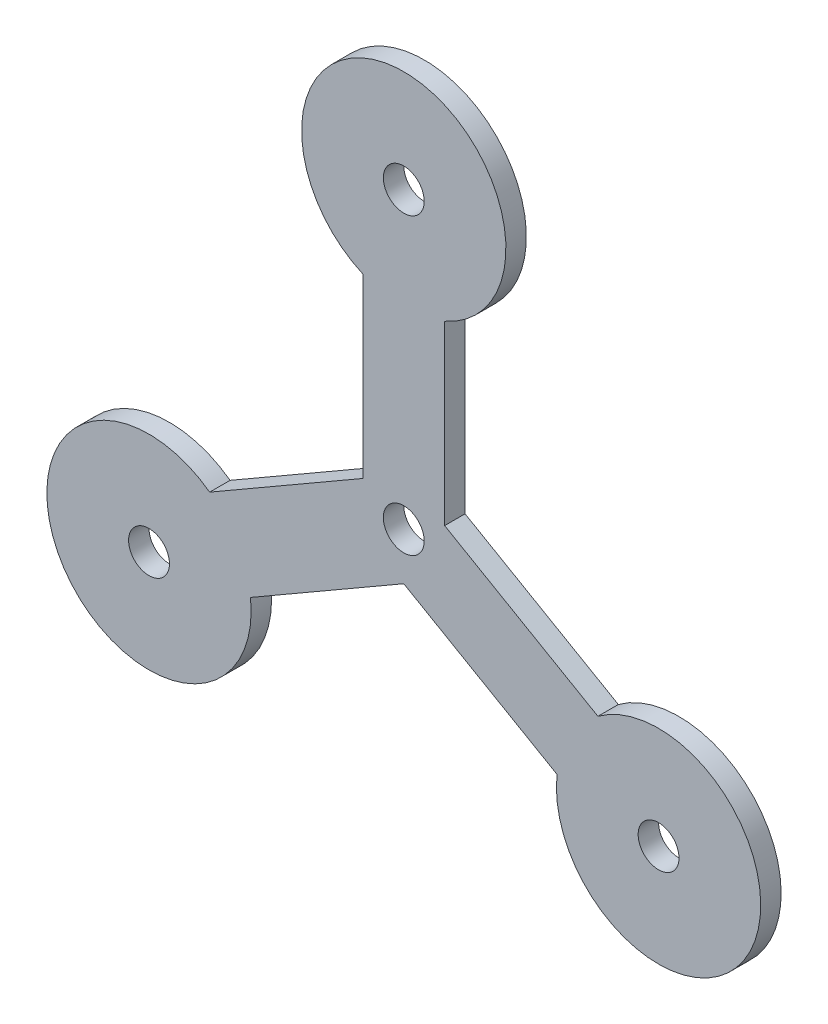
ISO-10303-21;
HEADER;
FILE_DESCRIPTION(('STEP AP214'),'2;1');
FILE_NAME('part.step','',(''),(''),'','','');
FILE_SCHEMA(('AUTOMOTIVE_DESIGN { 1 0 10303 214 1 1 1 1 }'));
ENDSEC;
DATA;
#1=APPLICATION_CONTEXT('core data for automotive mechanical design processes');
#2=APPLICATION_PROTOCOL_DEFINITION('international standard','automotive_design',2000,#1);
#3=PRODUCT_CONTEXT('',#1,'mechanical');
#4=PRODUCT('Part','Part','',(#3));
#5=PRODUCT_RELATED_PRODUCT_CATEGORY('part','',(#4));
#6=PRODUCT_DEFINITION_FORMATION('','',#4);
#7=PRODUCT_DEFINITION_CONTEXT('part definition',#1,'design');
#8=PRODUCT_DEFINITION('design','',#6,#7);
#9=PRODUCT_DEFINITION_SHAPE('','',#8);
#10=(LENGTH_UNIT() NAMED_UNIT(*) SI_UNIT(.MILLI.,.METRE.));
#11=(NAMED_UNIT(*) PLANE_ANGLE_UNIT() SI_UNIT($,.RADIAN.));
#12=(NAMED_UNIT(*) SI_UNIT($,.STERADIAN.) SOLID_ANGLE_UNIT());
#13=UNCERTAINTY_MEASURE_WITH_UNIT(LENGTH_MEASURE(1.E-05),#10,'distance_accuracy_value','');
#14=(GEOMETRIC_REPRESENTATION_CONTEXT(3) GLOBAL_UNCERTAINTY_ASSIGNED_CONTEXT((#13)) GLOBAL_UNIT_ASSIGNED_CONTEXT((#10,
#11,#12)) REPRESENTATION_CONTEXT('',''));
#15=CARTESIAN_POINT('',(0.,0.,0.));
#16=DIRECTION('',(0.,0.,1.));
#17=DIRECTION('',(1.,0.,0.));
#18=AXIS2_PLACEMENT_3D('',#15,#16,#17);
#19=CARTESIAN_POINT('',(-20.,11.5470053837933,10.));
#20=DIRECTION('',(1.,0.,0.));
#21=DIRECTION('',(0.,0.,-1.));
#22=AXIS2_PLACEMENT_3D('',#19,#20,#21);
#23=PLANE('',#22);
#24=DIRECTION('',(0.,-1.,0.));
#25=VECTOR('',#24,1.);
#26=CARTESIAN_POINT('',(-20.,11.5470053837933,10.));
#27=LINE('',#26,#25);
#28=CARTESIAN_POINT('',(-20.,98.1742430504419,10.));
#29=VERTEX_POINT('',#28);
#30=CARTESIAN_POINT('',(-20.,11.5470053837933,10.));
#31=VERTEX_POINT('',#30);
#32=EDGE_CURVE('E126',#29,#31,#27,.T.);
#33=ORIENTED_EDGE('',*,*,#32,.F.);
#34=DIRECTION('',(0.,0.,1.));
#35=VECTOR('',#34,1.);
#36=CARTESIAN_POINT('',(-20.,98.1742430504419,0.));
#37=LINE('',#36,#35);
#38=CARTESIAN_POINT('',(-20.,98.1742430504419,0.));
#39=VERTEX_POINT('',#38);
#40=EDGE_CURVE('E168',#29,#39,#37,.F.);
#41=ORIENTED_EDGE('',*,*,#40,.T.);
#42=DIRECTION('',(0.,-1.,0.));
#43=VECTOR('',#42,1.);
#44=CARTESIAN_POINT('',(-20.,11.5470053837933,0.));
#45=LINE('',#44,#43);
#46=CARTESIAN_POINT('',(-20.,11.5470053837933,0.));
#47=VERTEX_POINT('',#46);
#48=EDGE_CURVE('E149',#39,#47,#45,.T.);
#49=ORIENTED_EDGE('',*,*,#48,.T.);
#50=DIRECTION('',(0.,0.,-1.));
#51=VECTOR('',#50,1.);
#52=CARTESIAN_POINT('',(-20.,11.5470053837933,10.));
#53=LINE('',#52,#51);
#54=EDGE_CURVE('E11',#31,#47,#53,.T.);
#55=ORIENTED_EDGE('',*,*,#54,.F.);
#56=EDGE_LOOP('',(#33,#41,#49,#55));
#57=FACE_BOUND('',#56,.T.);
#58=ADVANCED_FACE('F32',(#57),#23,.F.);
#59=CARTESIAN_POINT('',(-134.707658144959,-54.6794919243113,10.));
#60=DIRECTION('',(0.500000000000004,-0.866025403784436,0.));
#61=DIRECTION('',(0.866025403784436,0.500000000000004,0.));
#62=AXIS2_PLACEMENT_3D('',#59,#60,#61);
#63=PLANE('',#62);
#64=DIRECTION('',(-0.866025403784436,-0.500000000000004,0.));
#65=VECTOR('',#64,1.);
#66=CARTESIAN_POINT('',(-134.707658144959,-54.6794919243113,0.));
#67=LINE('',#66,#65);
#68=CARTESIAN_POINT('',(-95.0213884789905,-31.7666134495318,0.));
#69=VERTEX_POINT('',#68);
#70=EDGE_CURVE('E148',#47,#69,#67,.T.);
#71=ORIENTED_EDGE('',*,*,#70,.T.);
#72=DIRECTION('',(0.,0.,1.));
#73=VECTOR('',#72,1.);
#74=CARTESIAN_POINT('',(-95.0213884789905,-31.7666134495319,0.));
#75=LINE('',#74,#73);
#76=CARTESIAN_POINT('',(-95.0213884789905,-31.7666134495318,10.));
#77=VERTEX_POINT('',#76);
#78=EDGE_CURVE('E153',#69,#77,#75,.T.);
#79=ORIENTED_EDGE('',*,*,#78,.T.);
#80=DIRECTION('',(-0.866025403784436,-0.500000000000004,0.));
#81=VECTOR('',#80,1.);
#82=CARTESIAN_POINT('',(-134.707658144959,-54.6794919243113,10.));
#83=LINE('',#82,#81);
#84=EDGE_CURVE('E160',#31,#77,#83,.T.);
#85=ORIENTED_EDGE('',*,*,#84,.F.);
#86=ORIENTED_EDGE('',*,*,#54,.T.);
#87=EDGE_LOOP('',(#71,#79,#85,#86));
#88=FACE_BOUND('',#87,.T.);
#89=ADVANCED_FACE('F231',(#88),#63,.F.);
#90=CARTESIAN_POINT('',(0.,-23.0940107675842,10.));
#91=DIRECTION('',(-0.500000000000005,0.866025403784436,0.));
#92=DIRECTION('',(-0.866025403784436,-0.500000000000005,0.));
#93=AXIS2_PLACEMENT_3D('',#90,#91,#92);
#94=PLANE('',#93);
#95=DIRECTION('',(0.866025403784436,0.500000000000004,0.));
#96=VECTOR('',#95,1.);
#97=CARTESIAN_POINT('',(0.,-23.0940107675842,10.));
#98=LINE('',#97,#96);
#99=CARTESIAN_POINT('',(-75.0213884789903,-66.4076296009093,10.));
#100=VERTEX_POINT('',#99);
#101=CARTESIAN_POINT('',(0.,-23.0940107675842,10.));
#102=VERTEX_POINT('',#101);
#103=EDGE_CURVE('E158',#100,#102,#98,.T.);
#104=ORIENTED_EDGE('',*,*,#103,.F.);
#105=DIRECTION('',(0.,0.,1.));
#106=VECTOR('',#105,1.);
#107=CARTESIAN_POINT('',(-75.0213884789903,-66.4076296009093,0.));
#108=LINE('',#107,#106);
#109=CARTESIAN_POINT('',(-75.0213884789903,-66.4076296009093,0.));
#110=VERTEX_POINT('',#109);
#111=EDGE_CURVE('E165',#100,#110,#108,.F.);
#112=ORIENTED_EDGE('',*,*,#111,.T.);
#113=DIRECTION('',(0.866025403784436,0.500000000000004,0.));
#114=VECTOR('',#113,1.);
#115=CARTESIAN_POINT('',(0.,-23.0940107675842,0.));
#116=LINE('',#115,#114);
#117=CARTESIAN_POINT('',(0.,-23.0940107675842,0.));
#118=VERTEX_POINT('',#117);
#119=EDGE_CURVE('E128',#110,#118,#116,.T.);
#120=ORIENTED_EDGE('',*,*,#119,.T.);
#121=DIRECTION('',(0.,0.,-1.));
#122=VECTOR('',#121,1.);
#123=CARTESIAN_POINT('',(0.,-23.0940107675842,10.));
#124=LINE('',#123,#122);
#125=EDGE_CURVE('E39',#102,#118,#124,.T.);
#126=ORIENTED_EDGE('',*,*,#125,.F.);
#127=EDGE_LOOP('',(#104,#112,#120,#126));
#128=FACE_BOUND('',#127,.T.);
#129=ADVANCED_FACE('F226',(#128),#94,.F.);
#130=CARTESIAN_POINT('',(114.707658144959,-89.3205080756888,10.));
#131=DIRECTION('',(0.500000000000004,0.866025403784436,0.));
#132=DIRECTION('',(-0.866025403784436,0.500000000000004,0.));
#133=AXIS2_PLACEMENT_3D('',#130,#131,#132);
#134=PLANE('',#133);
#135=DIRECTION('',(0.866025403784436,-0.500000000000004,0.));
#136=VECTOR('',#135,1.);
#137=CARTESIAN_POINT('',(114.707658144959,-89.3205080756888,0.));
#138=LINE('',#137,#136);
#139=CARTESIAN_POINT('',(75.0213884789898,-66.407629600909,0.));
#140=VERTEX_POINT('',#139);
#141=EDGE_CURVE('E124',#118,#140,#138,.T.);
#142=ORIENTED_EDGE('',*,*,#141,.T.);
#143=DIRECTION('',(0.,0.,1.));
#144=VECTOR('',#143,1.);
#145=CARTESIAN_POINT('',(75.0213884789898,-66.407629600909,0.));
#146=LINE('',#145,#144);
#147=CARTESIAN_POINT('',(75.0213884789898,-66.407629600909,10.));
#148=VERTEX_POINT('',#147);
#149=EDGE_CURVE('E106',#140,#148,#146,.T.);
#150=ORIENTED_EDGE('',*,*,#149,.T.);
#151=DIRECTION('',(0.866025403784436,-0.500000000000004,0.));
#152=VECTOR('',#151,1.);
#153=CARTESIAN_POINT('',(114.707658144959,-89.3205080756888,10.));
#154=LINE('',#153,#152);
#155=EDGE_CURVE('E139',#102,#148,#154,.T.);
#156=ORIENTED_EDGE('',*,*,#155,.F.);
#157=ORIENTED_EDGE('',*,*,#125,.T.);
#158=EDGE_LOOP('',(#142,#150,#156,#157));
#159=FACE_BOUND('',#158,.T.);
#160=ADVANCED_FACE('F138',(#159),#134,.F.);
#161=CARTESIAN_POINT('',(20.,11.5470053837933,10.));
#162=DIRECTION('',(-0.500000000000004,-0.866025403784436,0.));
#163=DIRECTION('',(0.866025403784436,-0.500000000000004,0.));
#164=AXIS2_PLACEMENT_3D('',#161,#162,#163);
#165=PLANE('',#164);
#166=DIRECTION('',(-0.866025403784436,0.500000000000004,0.));
#167=VECTOR('',#166,1.);
#168=CARTESIAN_POINT('',(20.,11.5470053837933,10.));
#169=LINE('',#168,#167);
#170=CARTESIAN_POINT('',(95.021388478991,-31.7666134495322,10.));
#171=VERTEX_POINT('',#170);
#172=CARTESIAN_POINT('',(20.,11.5470053837933,10.));
#173=VERTEX_POINT('',#172);
#174=EDGE_CURVE('E117',#171,#173,#169,.T.);
#175=ORIENTED_EDGE('',*,*,#174,.F.);
#176=DIRECTION('',(0.,0.,1.));
#177=VECTOR('',#176,1.);
#178=CARTESIAN_POINT('',(95.021388478991,-31.7666134495322,0.));
#179=LINE('',#178,#177);
#180=CARTESIAN_POINT('',(95.021388478991,-31.7666134495322,0.));
#181=VERTEX_POINT('',#180);
#182=EDGE_CURVE('E103',#171,#181,#179,.F.);
#183=ORIENTED_EDGE('',*,*,#182,.T.);
#184=DIRECTION('',(-0.866025403784436,0.500000000000004,0.));
#185=VECTOR('',#184,1.);
#186=CARTESIAN_POINT('',(20.,11.5470053837933,0.));
#187=LINE('',#186,#185);
#188=CARTESIAN_POINT('',(20.,11.5470053837933,0.));
#189=VERTEX_POINT('',#188);
#190=EDGE_CURVE('E115',#181,#189,#187,.T.);
#191=ORIENTED_EDGE('',*,*,#190,.T.);
#192=DIRECTION('',(0.,0.,-1.));
#193=VECTOR('',#192,1.);
#194=CARTESIAN_POINT('',(20.,11.5470053837933,10.));
#195=LINE('',#194,#193);
#196=EDGE_CURVE('E132',#173,#189,#195,.T.);
#197=ORIENTED_EDGE('',*,*,#196,.F.);
#198=EDGE_LOOP('',(#175,#183,#191,#197));
#199=FACE_BOUND('',#198,.T.);
#200=ADVANCED_FACE('F113',(#199),#165,.F.);
#201=CARTESIAN_POINT('',(20.,144.,10.));
#202=DIRECTION('',(-1.,0.,0.));
#203=DIRECTION('',(0.,0.,1.));
#204=AXIS2_PLACEMENT_3D('',#201,#202,#203);
#205=PLANE('',#204);
#206=DIRECTION('',(0.,1.,0.));
#207=VECTOR('',#206,1.);
#208=CARTESIAN_POINT('',(20.,144.,0.));
#209=LINE('',#208,#207);
#210=CARTESIAN_POINT('',(20.,98.1742430504413,0.));
#211=VERTEX_POINT('',#210);
#212=EDGE_CURVE('E123',#189,#211,#209,.T.);
#213=ORIENTED_EDGE('',*,*,#212,.T.);
#214=DIRECTION('',(0.,0.,1.));
#215=VECTOR('',#214,1.);
#216=CARTESIAN_POINT('',(20.,98.1742430504413,0.));
#217=LINE('',#216,#215);
#218=CARTESIAN_POINT('',(20.,98.1742430504413,10.));
#219=VERTEX_POINT('',#218);
#220=EDGE_CURVE('E172',#211,#219,#217,.T.);
#221=ORIENTED_EDGE('',*,*,#220,.T.);
#222=DIRECTION('',(0.,1.,0.));
#223=VECTOR('',#222,1.);
#224=CARTESIAN_POINT('',(20.,144.,10.));
#225=LINE('',#224,#223);
#226=EDGE_CURVE('E133',#173,#219,#225,.T.);
#227=ORIENTED_EDGE('',*,*,#226,.F.);
#228=ORIENTED_EDGE('',*,*,#196,.T.);
#229=EDGE_LOOP('',(#213,#221,#227,#228));
#230=FACE_BOUND('',#229,.T.);
#231=ADVANCED_FACE('F219',(#230),#205,.F.);
#232=CARTESIAN_POINT('',(0.,0.,10.));
#233=DIRECTION('',(0.,0.,1.));
#234=DIRECTION('',(1.,0.,0.));
#235=AXIS2_PLACEMENT_3D('',#232,#233,#234);
#236=PLANE('',#235);
#237=CARTESIAN_POINT('',(0.,0.,10.));
#238=DIRECTION('',(0.,0.,1.));
#239=DIRECTION('',(1.,0.,0.));
#240=AXIS2_PLACEMENT_3D('',#237,#238,#239);
#241=CIRCLE('',#240,10.);
#242=CARTESIAN_POINT('',(10.,0.,10.));
#243=VERTEX_POINT('',#242);
#244=EDGE_CURVE('E201',#243,#243,#241,.T.);
#245=ORIENTED_EDGE('',*,*,#244,.F.);
#246=EDGE_LOOP('',(#245));
#247=FACE_BOUND('',#246,.T.);
#248=CARTESIAN_POINT('',(-124.70765814495,-71.9999999999941,10.));
#249=DIRECTION('',(0.,0.,1.));
#250=DIRECTION('',(1.,0.,0.));
#251=AXIS2_PLACEMENT_3D('',#248,#249,#250);
#252=CIRCLE('',#251,10.0000000000037);
#253=CARTESIAN_POINT('',(-114.707658144947,-71.9999999999941,10.));
#254=VERTEX_POINT('',#253);
#255=EDGE_CURVE('E185',#254,#254,#252,.T.);
#256=ORIENTED_EDGE('',*,*,#255,.F.);
#257=EDGE_LOOP('',(#256));
#258=FACE_BOUND('',#257,.T.);
#259=CARTESIAN_POINT('',(124.707658144949,-71.9999999999965,10.));
#260=DIRECTION('',(0.,0.,1.));
#261=DIRECTION('',(1.,0.,0.));
#262=AXIS2_PLACEMENT_3D('',#259,#260,#261);
#263=CIRCLE('',#262,10.0000000000037);
#264=CARTESIAN_POINT('',(134.707658144953,-71.9999999999965,10.));
#265=VERTEX_POINT('',#264);
#266=EDGE_CURVE('E181',#265,#265,#263,.T.);
#267=ORIENTED_EDGE('',*,*,#266,.F.);
#268=EDGE_LOOP('',(#267));
#269=FACE_BOUND('',#268,.T.);
#270=CARTESIAN_POINT('',(1.40859546249317E-12,143.999999999989,10.));
#271=DIRECTION('',(0.,0.,1.));
#272=DIRECTION('',(1.,0.,0.));
#273=AXIS2_PLACEMENT_3D('',#270,#271,#272);
#274=CIRCLE('',#273,10.0000000000037);
#275=CARTESIAN_POINT('',(10.0000000000051,143.999999999989,10.));
#276=VERTEX_POINT('',#275);
#277=EDGE_CURVE('E188',#276,#276,#274,.T.);
#278=ORIENTED_EDGE('',*,*,#277,.F.);
#279=EDGE_LOOP('',(#278));
#280=FACE_BOUND('',#279,.T.);
#281=ORIENTED_EDGE('',*,*,#155,.T.);
#282=CARTESIAN_POINT('',(124.707658144958,-72.0000000000012,10.));
#283=DIRECTION('',(0.,0.,1.));
#284=DIRECTION('',(1.,0.,0.));
#285=AXIS2_PLACEMENT_3D('',#282,#283,#284);
#286=CIRCLE('',#285,50.);
#287=EDGE_CURVE('E46',#148,#171,#286,.T.);
#288=ORIENTED_EDGE('',*,*,#287,.T.);
#289=ORIENTED_EDGE('',*,*,#174,.T.);
#290=ORIENTED_EDGE('',*,*,#226,.T.);
#291=CARTESIAN_POINT('',(7.07767178198537E-13,144.,10.));
#292=DIRECTION('',(0.,0.,1.));
#293=DIRECTION('',(1.,0.,0.));
#294=AXIS2_PLACEMENT_3D('',#291,#292,#293);
#295=CIRCLE('',#294,50.);
#296=EDGE_CURVE('E176',#219,#29,#295,.T.);
#297=ORIENTED_EDGE('',*,*,#296,.T.);
#298=ORIENTED_EDGE('',*,*,#32,.T.);
#299=ORIENTED_EDGE('',*,*,#84,.T.);
#300=CARTESIAN_POINT('',(-124.707658144959,-72.,10.));
#301=DIRECTION('',(0.,0.,1.));
#302=DIRECTION('',(1.,0.,0.));
#303=AXIS2_PLACEMENT_3D('',#300,#301,#302);
#304=CIRCLE('',#303,50.);
#305=EDGE_CURVE('E53',#77,#100,#304,.T.);
#306=ORIENTED_EDGE('',*,*,#305,.T.);
#307=ORIENTED_EDGE('',*,*,#103,.T.);
#308=EDGE_LOOP('',(#281,#288,#289,#290,#297,#298,#299,#306,#307));
#309=FACE_BOUND('',#308,.T.);
#310=ADVANCED_FACE('F216',(#247,#258,#269,#280,#309),#236,.T.);
#311=CARTESIAN_POINT('',(0.,0.,0.));
#312=DIRECTION('',(0.,0.,1.));
#313=DIRECTION('',(1.,0.,0.));
#314=AXIS2_PLACEMENT_3D('',#311,#312,#313);
#315=PLANE('',#314);
#316=CARTESIAN_POINT('',(0.,0.,0.));
#317=DIRECTION('',(0.,0.,1.));
#318=DIRECTION('',(1.,0.,0.));
#319=AXIS2_PLACEMENT_3D('',#316,#317,#318);
#320=CIRCLE('',#319,10.);
#321=CARTESIAN_POINT('',(10.,0.,0.));
#322=VERTEX_POINT('',#321);
#323=EDGE_CURVE('E196',#322,#322,#320,.T.);
#324=ORIENTED_EDGE('',*,*,#323,.T.);
#325=EDGE_LOOP('',(#324));
#326=FACE_BOUND('',#325,.T.);
#327=CARTESIAN_POINT('',(-124.70765814495,-71.9999999999941,0.));
#328=DIRECTION('',(0.,0.,1.));
#329=DIRECTION('',(1.,0.,0.));
#330=AXIS2_PLACEMENT_3D('',#327,#328,#329);
#331=CIRCLE('',#330,10.0000000000037);
#332=CARTESIAN_POINT('',(-114.707658144947,-71.9999999999941,0.));
#333=VERTEX_POINT('',#332);
#334=EDGE_CURVE('E191',#333,#333,#331,.T.);
#335=ORIENTED_EDGE('',*,*,#334,.T.);
#336=EDGE_LOOP('',(#335));
#337=FACE_BOUND('',#336,.T.);
#338=CARTESIAN_POINT('',(1.40859546249317E-12,143.999999999989,0.));
#339=DIRECTION('',(0.,0.,1.));
#340=DIRECTION('',(1.,0.,0.));
#341=AXIS2_PLACEMENT_3D('',#338,#339,#340);
#342=CIRCLE('',#341,10.0000000000037);
#343=CARTESIAN_POINT('',(10.0000000000051,143.999999999989,0.));
#344=VERTEX_POINT('',#343);
#345=EDGE_CURVE('E195',#344,#344,#342,.T.);
#346=ORIENTED_EDGE('',*,*,#345,.T.);
#347=EDGE_LOOP('',(#346));
#348=FACE_BOUND('',#347,.T.);
#349=CARTESIAN_POINT('',(124.707658144949,-71.9999999999965,0.));
#350=DIRECTION('',(0.,0.,1.));
#351=DIRECTION('',(1.,0.,0.));
#352=AXIS2_PLACEMENT_3D('',#349,#350,#351);
#353=CIRCLE('',#352,10.0000000000037);
#354=CARTESIAN_POINT('',(134.707658144953,-71.9999999999965,0.));
#355=VERTEX_POINT('',#354);
#356=EDGE_CURVE('E192',#355,#355,#353,.T.);
#357=ORIENTED_EDGE('',*,*,#356,.T.);
#358=EDGE_LOOP('',(#357));
#359=FACE_BOUND('',#358,.T.);
#360=ORIENTED_EDGE('',*,*,#190,.F.);
#361=CARTESIAN_POINT('',(124.707658144958,-72.0000000000012,0.));
#362=DIRECTION('',(0.,0.,1.));
#363=DIRECTION('',(1.,0.,0.));
#364=AXIS2_PLACEMENT_3D('',#361,#362,#363);
#365=CIRCLE('',#364,50.);
#366=EDGE_CURVE('E100',#140,#181,#365,.T.);
#367=ORIENTED_EDGE('',*,*,#366,.F.);
#368=ORIENTED_EDGE('',*,*,#141,.F.);
#369=ORIENTED_EDGE('',*,*,#119,.F.);
#370=CARTESIAN_POINT('',(-124.707658144959,-72.,0.));
#371=DIRECTION('',(0.,0.,1.));
#372=DIRECTION('',(1.,0.,0.));
#373=AXIS2_PLACEMENT_3D('',#370,#371,#372);
#374=CIRCLE('',#373,50.);
#375=EDGE_CURVE('E145',#69,#110,#374,.T.);
#376=ORIENTED_EDGE('',*,*,#375,.F.);
#377=ORIENTED_EDGE('',*,*,#70,.F.);
#378=ORIENTED_EDGE('',*,*,#48,.F.);
#379=CARTESIAN_POINT('',(7.07767178198537E-13,144.,0.));
#380=DIRECTION('',(0.,0.,1.));
#381=DIRECTION('',(1.,0.,0.));
#382=AXIS2_PLACEMENT_3D('',#379,#380,#381);
#383=CIRCLE('',#382,50.);
#384=EDGE_CURVE('E175',#211,#39,#383,.T.);
#385=ORIENTED_EDGE('',*,*,#384,.F.);
#386=ORIENTED_EDGE('',*,*,#212,.F.);
#387=EDGE_LOOP('',(#360,#367,#368,#369,#376,#377,#378,#385,#386));
#388=FACE_BOUND('',#387,.T.);
#389=ADVANCED_FACE('F120',(#326,#337,#348,#359,#388),#315,.F.);
#390=CARTESIAN_POINT('',(-124.707658144959,-72.,0.));
#391=DIRECTION('',(0.,0.,1.));
#392=DIRECTION('',(1.,0.,0.));
#393=AXIS2_PLACEMENT_3D('',#390,#391,#392);
#394=CYLINDRICAL_SURFACE('',#393,50.);
#395=ORIENTED_EDGE('',*,*,#78,.F.);
#396=ORIENTED_EDGE('',*,*,#375,.T.);
#397=ORIENTED_EDGE('',*,*,#111,.F.);
#398=ORIENTED_EDGE('',*,*,#305,.F.);
#399=EDGE_LOOP('',(#395,#396,#397,#398));
#400=FACE_BOUND('',#399,.T.);
#401=ADVANCED_FACE('F228',(#400),#394,.T.);
#402=CARTESIAN_POINT('',(7.07767178198537E-13,144.,0.));
#403=DIRECTION('',(0.,0.,1.));
#404=DIRECTION('',(1.,0.,0.));
#405=AXIS2_PLACEMENT_3D('',#402,#403,#404);
#406=CYLINDRICAL_SURFACE('',#405,50.);
#407=ORIENTED_EDGE('',*,*,#40,.F.);
#408=ORIENTED_EDGE('',*,*,#296,.F.);
#409=ORIENTED_EDGE('',*,*,#220,.F.);
#410=ORIENTED_EDGE('',*,*,#384,.T.);
#411=EDGE_LOOP('',(#407,#408,#409,#410));
#412=FACE_BOUND('',#411,.T.);
#413=ADVANCED_FACE('F239',(#412),#406,.T.);
#414=CARTESIAN_POINT('',(124.707658144958,-72.0000000000012,0.));
#415=DIRECTION('',(0.,0.,1.));
#416=DIRECTION('',(1.,0.,0.));
#417=AXIS2_PLACEMENT_3D('',#414,#415,#416);
#418=CYLINDRICAL_SURFACE('',#417,50.);
#419=ORIENTED_EDGE('',*,*,#149,.F.);
#420=ORIENTED_EDGE('',*,*,#366,.T.);
#421=ORIENTED_EDGE('',*,*,#182,.F.);
#422=ORIENTED_EDGE('',*,*,#287,.F.);
#423=EDGE_LOOP('',(#419,#420,#421,#422));
#424=FACE_BOUND('',#423,.T.);
#425=ADVANCED_FACE('F102',(#424),#418,.T.);
#426=CARTESIAN_POINT('',(124.707658144949,-71.9999999999965,0.));
#427=DIRECTION('',(0.,0.,1.));
#428=DIRECTION('',(1.,0.,0.));
#429=AXIS2_PLACEMENT_3D('',#426,#427,#428);
#430=CYLINDRICAL_SURFACE('',#429,10.0000000000037);
#431=ORIENTED_EDGE('',*,*,#266,.T.);
#432=EDGE_LOOP('',(#431));
#433=FACE_BOUND('',#432,.T.);
#434=ORIENTED_EDGE('',*,*,#356,.F.);
#435=EDGE_LOOP('',(#434));
#436=FACE_BOUND('',#435,.T.);
#437=ADVANCED_FACE('F246',(#433,#436),#430,.F.);
#438=CARTESIAN_POINT('',(1.40859546249317E-12,143.999999999989,0.));
#439=DIRECTION('',(0.,0.,1.));
#440=DIRECTION('',(1.,0.,0.));
#441=AXIS2_PLACEMENT_3D('',#438,#439,#440);
#442=CYLINDRICAL_SURFACE('',#441,10.0000000000037);
#443=ORIENTED_EDGE('',*,*,#277,.T.);
#444=EDGE_LOOP('',(#443));
#445=FACE_BOUND('',#444,.T.);
#446=ORIENTED_EDGE('',*,*,#345,.F.);
#447=EDGE_LOOP('',(#446));
#448=FACE_BOUND('',#447,.T.);
#449=ADVANCED_FACE('F299',(#445,#448),#442,.F.);
#450=CARTESIAN_POINT('',(-124.70765814495,-71.9999999999941,0.));
#451=DIRECTION('',(0.,0.,1.));
#452=DIRECTION('',(1.,0.,0.));
#453=AXIS2_PLACEMENT_3D('',#450,#451,#452);
#454=CYLINDRICAL_SURFACE('',#453,10.0000000000037);
#455=ORIENTED_EDGE('',*,*,#255,.T.);
#456=EDGE_LOOP('',(#455));
#457=FACE_BOUND('',#456,.T.);
#458=ORIENTED_EDGE('',*,*,#334,.F.);
#459=EDGE_LOOP('',(#458));
#460=FACE_BOUND('',#459,.T.);
#461=ADVANCED_FACE('F212',(#457,#460),#454,.F.);
#462=CARTESIAN_POINT('',(0.,0.,0.));
#463=DIRECTION('',(0.,0.,1.));
#464=DIRECTION('',(1.,0.,0.));
#465=AXIS2_PLACEMENT_3D('',#462,#463,#464);
#466=CYLINDRICAL_SURFACE('',#465,10.);
#467=ORIENTED_EDGE('',*,*,#323,.F.);
#468=EDGE_LOOP('',(#467));
#469=FACE_BOUND('',#468,.T.);
#470=ORIENTED_EDGE('',*,*,#244,.T.);
#471=EDGE_LOOP('',(#470));
#472=FACE_BOUND('',#471,.T.);
#473=ADVANCED_FACE('F209',(#469,#472),#466,.F.);
#474=CLOSED_SHELL('',(#58,#89,#129,#160,#200,#231,#310,#389,#401,#413,#425,#437,#449,#461,#473));
#475=MANIFOLD_SOLID_BREP('B2',#474);
#476=ADVANCED_BREP_SHAPE_REPRESENTATION('',(#18,#475),#14);
#477=SHAPE_DEFINITION_REPRESENTATION(#9,#476);
ENDSEC;
END-ISO-10303-21;
